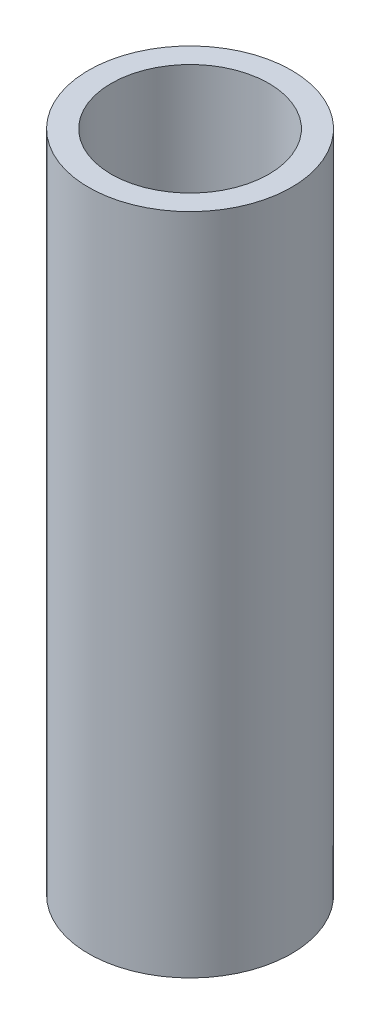
ISO-10303-21;
HEADER;
FILE_DESCRIPTION(('STEP AP214'),'2;1');
FILE_NAME('part.step','',(''),(''),'','','');
FILE_SCHEMA(('AUTOMOTIVE_DESIGN { 1 0 10303 214 1 1 1 1 }'));
ENDSEC;
DATA;
#1=APPLICATION_CONTEXT('core data for automotive mechanical design processes');
#2=APPLICATION_PROTOCOL_DEFINITION('international standard','automotive_design',2000,#1);
#3=PRODUCT_CONTEXT('',#1,'mechanical');
#4=PRODUCT('Part','Part','',(#3));
#5=PRODUCT_RELATED_PRODUCT_CATEGORY('part','',(#4));
#6=PRODUCT_DEFINITION_FORMATION('','',#4);
#7=PRODUCT_DEFINITION_CONTEXT('part definition',#1,'design');
#8=PRODUCT_DEFINITION('design','',#6,#7);
#9=PRODUCT_DEFINITION_SHAPE('','',#8);
#10=(LENGTH_UNIT() NAMED_UNIT(*) SI_UNIT(.MILLI.,.METRE.));
#11=(NAMED_UNIT(*) PLANE_ANGLE_UNIT() SI_UNIT($,.RADIAN.));
#12=(NAMED_UNIT(*) SI_UNIT($,.STERADIAN.) SOLID_ANGLE_UNIT());
#13=UNCERTAINTY_MEASURE_WITH_UNIT(LENGTH_MEASURE(1.E-05),#10,'distance_accuracy_value','');
#14=(GEOMETRIC_REPRESENTATION_CONTEXT(3) GLOBAL_UNCERTAINTY_ASSIGNED_CONTEXT((#13)) GLOBAL_UNIT_ASSIGNED_CONTEXT((#10,
#11,#12)) REPRESENTATION_CONTEXT('',''));
#15=CARTESIAN_POINT('',(0.,0.,0.));
#16=DIRECTION('',(0.,0.,1.));
#17=DIRECTION('',(1.,0.,0.));
#18=AXIS2_PLACEMENT_3D('',#15,#16,#17);
#19=CARTESIAN_POINT('',(0.,13.,0.));
#20=DIRECTION('',(0.,1.,0.));
#21=DIRECTION('',(0.,0.,1.));
#22=AXIS2_PLACEMENT_3D('',#19,#20,#21);
#23=PLANE('',#22);
#24=CARTESIAN_POINT('',(0.,13.,0.));
#25=DIRECTION('',(0.,1.,0.));
#26=DIRECTION('',(0.,0.,1.));
#27=AXIS2_PLACEMENT_3D('',#24,#25,#26);
#28=CIRCLE('',#27,3.9751);
#29=CARTESIAN_POINT('',(0.,13.,-3.9751));
#30=VERTEX_POINT('',#29);
#31=EDGE_CURVE('E10',#30,#30,#28,.T.);
#32=ORIENTED_EDGE('',*,*,#31,.T.);
#33=EDGE_LOOP('',(#32));
#34=FACE_BOUND('',#33,.T.);
#35=CARTESIAN_POINT('',(0.,13.,0.));
#36=DIRECTION('',(0.,1.,0.));
#37=DIRECTION('',(0.,0.,1.));
#38=AXIS2_PLACEMENT_3D('',#35,#36,#37);
#39=CIRCLE('',#38,3.0861);
#40=CARTESIAN_POINT('',(0.,13.,-3.0861));
#41=VERTEX_POINT('',#40);
#42=EDGE_CURVE('E46',#41,#41,#39,.T.);
#43=ORIENTED_EDGE('',*,*,#42,.F.);
#44=EDGE_LOOP('',(#43));
#45=FACE_BOUND('',#44,.T.);
#46=ADVANCED_FACE('F35',(#34,#45),#23,.T.);
#47=CARTESIAN_POINT('',(0.,-13.,0.));
#48=DIRECTION('',(0.,1.,0.));
#49=DIRECTION('',(0.,0.,1.));
#50=AXIS2_PLACEMENT_3D('',#47,#48,#49);
#51=PLANE('',#50);
#52=CARTESIAN_POINT('',(0.,-13.,0.));
#53=DIRECTION('',(0.,1.,0.));
#54=DIRECTION('',(0.,0.,1.));
#55=AXIS2_PLACEMENT_3D('',#52,#53,#54);
#56=CIRCLE('',#55,3.9751);
#57=CARTESIAN_POINT('',(0.,-13.,-3.9751));
#58=VERTEX_POINT('',#57);
#59=EDGE_CURVE('E39',#58,#58,#56,.T.);
#60=ORIENTED_EDGE('',*,*,#59,.F.);
#61=EDGE_LOOP('',(#60));
#62=FACE_BOUND('',#61,.T.);
#63=CARTESIAN_POINT('',(0.,-13.,0.));
#64=DIRECTION('',(0.,1.,0.));
#65=DIRECTION('',(0.,0.,1.));
#66=AXIS2_PLACEMENT_3D('',#63,#64,#65);
#67=CIRCLE('',#66,3.0861);
#68=CARTESIAN_POINT('',(0.,-13.,-3.0861));
#69=VERTEX_POINT('',#68);
#70=EDGE_CURVE('E48',#69,#69,#67,.T.);
#71=ORIENTED_EDGE('',*,*,#70,.T.);
#72=EDGE_LOOP('',(#71));
#73=FACE_BOUND('',#72,.T.);
#74=ADVANCED_FACE('F58',(#62,#73),#51,.F.);
#75=CARTESIAN_POINT('',(0.,13.,0.));
#76=DIRECTION('',(0.,-1.,0.));
#77=DIRECTION('',(0.,0.,-1.));
#78=AXIS2_PLACEMENT_3D('',#75,#76,#77);
#79=CYLINDRICAL_SURFACE('',#78,3.9751);
#80=CARTESIAN_POINT('',(0.,13.,-3.9751));
#81=CARTESIAN_POINT('',(0.,12.7291666666667,-3.9751));
#82=CARTESIAN_POINT('',(0.,12.4583333333333,-3.9751));
#83=CARTESIAN_POINT('',(0.,11.9166666666667,-3.9751));
#84=CARTESIAN_POINT('',(0.,11.6458333333333,-3.9751));
#85=CARTESIAN_POINT('',(0.,11.1041666666667,-3.9751));
#86=CARTESIAN_POINT('',(0.,10.8333333333333,-3.9751));
#87=CARTESIAN_POINT('',(0.,10.2916666666667,-3.9751));
#88=CARTESIAN_POINT('',(0.,10.0208333333333,-3.9751));
#89=CARTESIAN_POINT('',(0.,9.47916666666667,-3.9751));
#90=CARTESIAN_POINT('',(0.,9.20833333333333,-3.9751));
#91=CARTESIAN_POINT('',(0.,8.66666666666667,-3.9751));
#92=CARTESIAN_POINT('',(0.,8.39583333333333,-3.9751));
#93=CARTESIAN_POINT('',(0.,7.85416666666667,-3.9751));
#94=CARTESIAN_POINT('',(0.,7.58333333333333,-3.9751));
#95=CARTESIAN_POINT('',(0.,7.04166666666667,-3.9751));
#96=CARTESIAN_POINT('',(0.,6.77083333333333,-3.9751));
#97=CARTESIAN_POINT('',(0.,6.22916666666667,-3.9751));
#98=CARTESIAN_POINT('',(0.,5.95833333333333,-3.9751));
#99=CARTESIAN_POINT('',(0.,5.41666666666667,-3.9751));
#100=CARTESIAN_POINT('',(0.,5.14583333333333,-3.9751));
#101=CARTESIAN_POINT('',(0.,4.60416666666667,-3.9751));
#102=CARTESIAN_POINT('',(0.,4.33333333333333,-3.9751));
#103=CARTESIAN_POINT('',(0.,3.79166666666667,-3.9751));
#104=CARTESIAN_POINT('',(0.,3.52083333333333,-3.9751));
#105=CARTESIAN_POINT('',(0.,2.97916666666667,-3.9751));
#106=CARTESIAN_POINT('',(0.,2.70833333333333,-3.9751));
#107=CARTESIAN_POINT('',(0.,2.16666666666667,-3.9751));
#108=CARTESIAN_POINT('',(0.,1.89583333333333,-3.9751));
#109=CARTESIAN_POINT('',(0.,1.35416666666667,-3.9751));
#110=CARTESIAN_POINT('',(0.,1.08333333333333,-3.9751));
#111=CARTESIAN_POINT('',(0.,0.541666666666667,-3.9751));
#112=CARTESIAN_POINT('',(0.,0.270833333333333,-3.9751));
#113=CARTESIAN_POINT('',(0.,-0.270833333333333,-3.9751));
#114=CARTESIAN_POINT('',(0.,-0.541666666666667,-3.9751));
#115=CARTESIAN_POINT('',(0.,-1.08333333333333,-3.9751));
#116=CARTESIAN_POINT('',(0.,-1.35416666666667,-3.9751));
#117=CARTESIAN_POINT('',(0.,-1.89583333333333,-3.9751));
#118=CARTESIAN_POINT('',(0.,-2.16666666666667,-3.9751));
#119=CARTESIAN_POINT('',(0.,-2.70833333333333,-3.9751));
#120=CARTESIAN_POINT('',(0.,-2.97916666666667,-3.9751));
#121=CARTESIAN_POINT('',(0.,-3.52083333333333,-3.9751));
#122=CARTESIAN_POINT('',(0.,-3.79166666666667,-3.9751));
#123=CARTESIAN_POINT('',(0.,-4.33333333333333,-3.9751));
#124=CARTESIAN_POINT('',(0.,-4.60416666666667,-3.9751));
#125=CARTESIAN_POINT('',(0.,-5.14583333333333,-3.9751));
#126=CARTESIAN_POINT('',(0.,-5.41666666666667,-3.9751));
#127=CARTESIAN_POINT('',(0.,-5.95833333333333,-3.9751));
#128=CARTESIAN_POINT('',(0.,-6.22916666666667,-3.9751));
#129=CARTESIAN_POINT('',(0.,-6.77083333333333,-3.9751));
#130=CARTESIAN_POINT('',(0.,-7.04166666666667,-3.9751));
#131=CARTESIAN_POINT('',(0.,-7.58333333333333,-3.9751));
#132=CARTESIAN_POINT('',(0.,-7.85416666666667,-3.9751));
#133=CARTESIAN_POINT('',(0.,-8.39583333333333,-3.9751));
#134=CARTESIAN_POINT('',(0.,-8.66666666666667,-3.9751));
#135=CARTESIAN_POINT('',(0.,-9.20833333333333,-3.9751));
#136=CARTESIAN_POINT('',(0.,-9.47916666666667,-3.9751));
#137=CARTESIAN_POINT('',(0.,-10.0208333333333,-3.9751));
#138=CARTESIAN_POINT('',(0.,-10.2916666666667,-3.9751));
#139=CARTESIAN_POINT('',(0.,-10.8333333333333,-3.9751));
#140=CARTESIAN_POINT('',(0.,-11.1041666666667,-3.9751));
#141=CARTESIAN_POINT('',(0.,-11.6458333333333,-3.9751));
#142=CARTESIAN_POINT('',(0.,-11.9166666666667,-3.9751));
#143=CARTESIAN_POINT('',(0.,-12.4583333333333,-3.9751));
#144=CARTESIAN_POINT('',(0.,-12.7291666666667,-3.9751));
#145=CARTESIAN_POINT('',(0.,-13.,-3.9751));
#146=B_SPLINE_CURVE_WITH_KNOTS('',3,(#80,#81,#82,#83,#84,#85,#86,#87,#88,#89,#90,#91,#92,#93,
#94,#95,#96,#97,#98,#99,#100,#101,#102,#103,#104,#105,#106,#107,#108,#109,#110,#111,#112,#113,
#114,#115,#116,#117,#118,#119,#120,#121,#122,#123,#124,#125,#126,#127,#128,#129,#130,#131,#132,
#133,#134,#135,#136,#137,#138,#139,#140,#141,#142,#143,#144,#145),.UNSPECIFIED.,.F.,.F.,(4,2,2,
2,2,2,2,2,2,2,2,2,2,2,2,2,2,2,2,2,2,2,2,2,2,2,2,2,2,2,2,2,4),(0.,0.812500000000001,1.625,2.4375,
3.25,4.0625,4.875,5.6875,6.5,7.3125,8.125,8.9375,9.75,10.5625,11.375,12.1875,13.,13.8125,14.625,
15.4375,16.25,17.0625,17.875,18.6875,19.5,20.3125,21.125,21.9375,22.75,23.5625,24.375,25.1875,
26.),.UNSPECIFIED.);
#147=EDGE_CURVE('BSEAM37',#30,#58,#146,.T.);
#148=ORIENTED_EDGE('',*,*,#31,.F.);
#149=ORIENTED_EDGE('',*,*,#59,.T.);
#150=ORIENTED_EDGE('',*,*,#147,.T.);
#151=ORIENTED_EDGE('',*,*,#147,.F.);
#152=EDGE_LOOP('',(#148,#150,#149,#151));
#153=FACE_BOUND('',#152,.T.);
#154=ADVANCED_FACE('F37',(#153),#79,.T.);
#155=CARTESIAN_POINT('',(0.,13.,0.));
#156=DIRECTION('',(0.,-1.,0.));
#157=DIRECTION('',(0.,0.,-1.));
#158=AXIS2_PLACEMENT_3D('',#155,#156,#157);
#159=CYLINDRICAL_SURFACE('',#158,3.0861);
#160=CARTESIAN_POINT('',(0.,13.,-3.0861));
#161=CARTESIAN_POINT('',(0.,12.7291666666667,-3.0861));
#162=CARTESIAN_POINT('',(0.,12.4583333333333,-3.0861));
#163=CARTESIAN_POINT('',(0.,11.9166666666667,-3.0861));
#164=CARTESIAN_POINT('',(0.,11.6458333333333,-3.0861));
#165=CARTESIAN_POINT('',(0.,11.1041666666667,-3.0861));
#166=CARTESIAN_POINT('',(0.,10.8333333333333,-3.0861));
#167=CARTESIAN_POINT('',(0.,10.2916666666667,-3.0861));
#168=CARTESIAN_POINT('',(0.,10.0208333333333,-3.0861));
#169=CARTESIAN_POINT('',(0.,9.47916666666667,-3.0861));
#170=CARTESIAN_POINT('',(0.,9.20833333333333,-3.0861));
#171=CARTESIAN_POINT('',(0.,8.66666666666667,-3.0861));
#172=CARTESIAN_POINT('',(0.,8.39583333333333,-3.0861));
#173=CARTESIAN_POINT('',(0.,7.85416666666667,-3.0861));
#174=CARTESIAN_POINT('',(0.,7.58333333333333,-3.0861));
#175=CARTESIAN_POINT('',(0.,7.04166666666667,-3.0861));
#176=CARTESIAN_POINT('',(0.,6.77083333333333,-3.0861));
#177=CARTESIAN_POINT('',(0.,6.22916666666667,-3.0861));
#178=CARTESIAN_POINT('',(0.,5.95833333333333,-3.0861));
#179=CARTESIAN_POINT('',(0.,5.41666666666667,-3.0861));
#180=CARTESIAN_POINT('',(0.,5.14583333333333,-3.0861));
#181=CARTESIAN_POINT('',(0.,4.60416666666667,-3.0861));
#182=CARTESIAN_POINT('',(0.,4.33333333333333,-3.0861));
#183=CARTESIAN_POINT('',(0.,3.79166666666667,-3.0861));
#184=CARTESIAN_POINT('',(0.,3.52083333333333,-3.0861));
#185=CARTESIAN_POINT('',(0.,2.97916666666666,-3.0861));
#186=CARTESIAN_POINT('',(0.,2.70833333333333,-3.0861));
#187=CARTESIAN_POINT('',(0.,2.16666666666667,-3.0861));
#188=CARTESIAN_POINT('',(0.,1.89583333333333,-3.0861));
#189=CARTESIAN_POINT('',(0.,1.35416666666666,-3.0861));
#190=CARTESIAN_POINT('',(0.,1.08333333333333,-3.0861));
#191=CARTESIAN_POINT('',(0.,0.541666666666665,-3.0861));
#192=CARTESIAN_POINT('',(0.,0.270833333333332,-3.0861));
#193=CARTESIAN_POINT('',(0.,-0.270833333333335,-3.0861));
#194=CARTESIAN_POINT('',(0.,-0.541666666666669,-3.0861));
#195=CARTESIAN_POINT('',(0.,-1.08333333333334,-3.0861));
#196=CARTESIAN_POINT('',(0.,-1.35416666666667,-3.0861));
#197=CARTESIAN_POINT('',(0.,-1.89583333333333,-3.0861));
#198=CARTESIAN_POINT('',(0.,-2.16666666666667,-3.0861));
#199=CARTESIAN_POINT('',(0.,-2.70833333333333,-3.0861));
#200=CARTESIAN_POINT('',(0.,-2.97916666666667,-3.0861));
#201=CARTESIAN_POINT('',(0.,-3.52083333333333,-3.0861));
#202=CARTESIAN_POINT('',(0.,-3.79166666666667,-3.0861));
#203=CARTESIAN_POINT('',(0.,-4.33333333333333,-3.0861));
#204=CARTESIAN_POINT('',(0.,-4.60416666666667,-3.0861));
#205=CARTESIAN_POINT('',(0.,-5.14583333333333,-3.0861));
#206=CARTESIAN_POINT('',(0.,-5.41666666666667,-3.0861));
#207=CARTESIAN_POINT('',(0.,-5.95833333333333,-3.0861));
#208=CARTESIAN_POINT('',(0.,-6.22916666666667,-3.0861));
#209=CARTESIAN_POINT('',(0.,-6.77083333333333,-3.0861));
#210=CARTESIAN_POINT('',(0.,-7.04166666666667,-3.0861));
#211=CARTESIAN_POINT('',(0.,-7.58333333333333,-3.0861));
#212=CARTESIAN_POINT('',(0.,-7.85416666666667,-3.0861));
#213=CARTESIAN_POINT('',(0.,-8.39583333333333,-3.0861));
#214=CARTESIAN_POINT('',(0.,-8.66666666666667,-3.0861));
#215=CARTESIAN_POINT('',(0.,-9.20833333333333,-3.0861));
#216=CARTESIAN_POINT('',(0.,-9.47916666666667,-3.0861));
#217=CARTESIAN_POINT('',(0.,-10.0208333333333,-3.0861));
#218=CARTESIAN_POINT('',(0.,-10.2916666666667,-3.0861));
#219=CARTESIAN_POINT('',(0.,-10.8333333333333,-3.0861));
#220=CARTESIAN_POINT('',(0.,-11.1041666666667,-3.0861));
#221=CARTESIAN_POINT('',(0.,-11.6458333333333,-3.0861));
#222=CARTESIAN_POINT('',(0.,-11.9166666666667,-3.0861));
#223=CARTESIAN_POINT('',(0.,-12.4583333333333,-3.0861));
#224=CARTESIAN_POINT('',(0.,-12.7291666666667,-3.0861));
#225=CARTESIAN_POINT('',(0.,-13.,-3.0861));
#226=B_SPLINE_CURVE_WITH_KNOTS('',3,(#160,#161,#162,#163,#164,#165,#166,#167,#168,#169,#170,
#171,#172,#173,#174,#175,#176,#177,#178,#179,#180,#181,#182,#183,#184,#185,#186,#187,#188,#189,
#190,#191,#192,#193,#194,#195,#196,#197,#198,#199,#200,#201,#202,#203,#204,#205,#206,#207,#208,
#209,#210,#211,#212,#213,#214,#215,#216,#217,#218,#219,#220,#221,#222,#223,#224,#225),
.UNSPECIFIED.,.F.,.F.,(4,2,2,2,2,2,2,2,2,2,2,2,2,2,2,2,2,2,2,2,2,2,2,2,2,2,2,2,2,2,2,2,4),(0.,
0.812499999999999,1.625,2.4375,3.25,4.0625,4.875,5.6875,6.5,7.3125,8.125,8.9375,9.75,10.5625,
11.375,12.1875,13.,13.8125,14.625,15.4375,16.25,17.0625,17.875,18.6875,19.5,20.3125,21.125,
21.9375,22.75,23.5625,24.375,25.1875,26.),.UNSPECIFIED.);
#227=EDGE_CURVE('BSEAM54',#41,#69,#226,.T.);
#228=ORIENTED_EDGE('',*,*,#42,.T.);
#229=ORIENTED_EDGE('',*,*,#70,.F.);
#230=ORIENTED_EDGE('',*,*,#227,.T.);
#231=ORIENTED_EDGE('',*,*,#227,.F.);
#232=EDGE_LOOP('',(#228,#230,#229,#231));
#233=FACE_BOUND('',#232,.T.);
#234=ADVANCED_FACE('F54',(#233),#159,.F.);
#235=CLOSED_SHELL('',(#46,#74,#154,#234));
#236=MANIFOLD_SOLID_BREP('B2',#235);
#237=ADVANCED_BREP_SHAPE_REPRESENTATION('',(#18,#236),#14);
#238=SHAPE_DEFINITION_REPRESENTATION(#9,#237);
ENDSEC;
END-ISO-10303-21;
